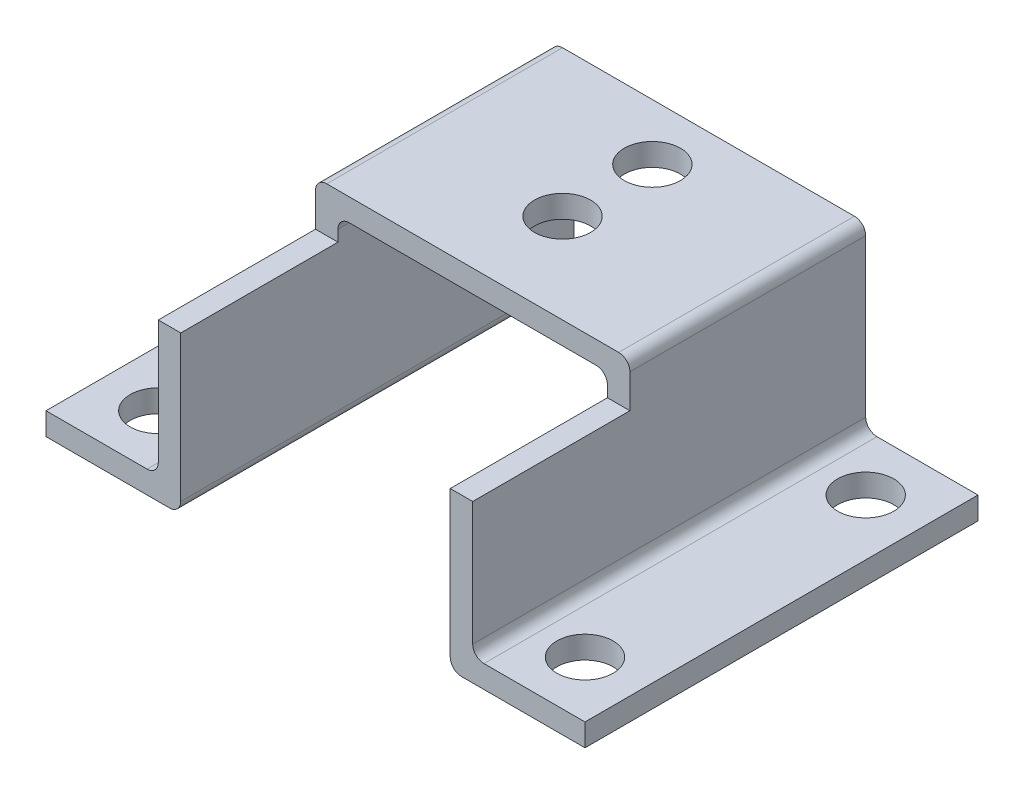
ISO-10303-21;
HEADER;
FILE_DESCRIPTION(('STEP AP214'),'2;1');
FILE_NAME('part.step','',(''),(''),'','','');
FILE_SCHEMA(('AUTOMOTIVE_DESIGN { 1 0 10303 214 1 1 1 1 }'));
ENDSEC;
DATA;
#1=APPLICATION_CONTEXT('core data for automotive mechanical design processes');
#2=APPLICATION_PROTOCOL_DEFINITION('international standard','automotive_design',2000,#1);
#3=PRODUCT_CONTEXT('',#1,'mechanical');
#4=PRODUCT('Part','Part','',(#3));
#5=PRODUCT_RELATED_PRODUCT_CATEGORY('part','',(#4));
#6=PRODUCT_DEFINITION_FORMATION('','',#4);
#7=PRODUCT_DEFINITION_CONTEXT('part definition',#1,'design');
#8=PRODUCT_DEFINITION('design','',#6,#7);
#9=PRODUCT_DEFINITION_SHAPE('','',#8);
#10=(LENGTH_UNIT() NAMED_UNIT(*) SI_UNIT(.MILLI.,.METRE.));
#11=(NAMED_UNIT(*) PLANE_ANGLE_UNIT() SI_UNIT($,.RADIAN.));
#12=(NAMED_UNIT(*) SI_UNIT($,.STERADIAN.) SOLID_ANGLE_UNIT());
#13=UNCERTAINTY_MEASURE_WITH_UNIT(LENGTH_MEASURE(1.E-05),#10,'distance_accuracy_value','');
#14=(GEOMETRIC_REPRESENTATION_CONTEXT(3) GLOBAL_UNCERTAINTY_ASSIGNED_CONTEXT((#13)) GLOBAL_UNIT_ASSIGNED_CONTEXT((#10,
#11,#12)) REPRESENTATION_CONTEXT('',''));
#15=CARTESIAN_POINT('',(0.,0.,0.));
#16=DIRECTION('',(0.,0.,1.));
#17=DIRECTION('',(1.,0.,0.));
#18=AXIS2_PLACEMENT_3D('',#15,#16,#17);
#19=CARTESIAN_POINT('',(-15.,1.,35.));
#20=DIRECTION('',(0.,0.,1.));
#21=DIRECTION('',(1.,0.,0.));
#22=AXIS2_PLACEMENT_3D('',#19,#20,#21);
#23=PLANE('',#22);
#24=DIRECTION('',(1.,0.,0.));
#25=VECTOR('',#24,1.);
#26=CARTESIAN_POINT('',(-15.,12.,35.));
#27=LINE('',#26,#25);
#28=CARTESIAN_POINT('',(-14.,12.,35.));
#29=VERTEX_POINT('',#28);
#30=CARTESIAN_POINT('',(-12.,12.,35.));
#31=VERTEX_POINT('',#30);
#32=EDGE_CURVE('E53',#29,#31,#27,.T.);
#33=ORIENTED_EDGE('',*,*,#32,.F.);
#34=DIRECTION('',(0.,-1.,0.));
#35=VECTOR('',#34,1.);
#36=CARTESIAN_POINT('',(-14.,1.00000000000001,35.));
#37=LINE('',#36,#35);
#38=CARTESIAN_POINT('',(-14.,1.,35.));
#39=VERTEX_POINT('',#38);
#40=EDGE_CURVE('E176',#29,#39,#37,.T.);
#41=ORIENTED_EDGE('',*,*,#40,.T.);
#42=CARTESIAN_POINT('',(-15.,1.,35.));
#43=DIRECTION('',(0.,0.,-1.));
#44=DIRECTION('',(1.,0.,0.));
#45=AXIS2_PLACEMENT_3D('',#42,#43,#44);
#46=CIRCLE('',#45,1.);
#47=CARTESIAN_POINT('',(-15.,0.,35.));
#48=VERTEX_POINT('',#47);
#49=EDGE_CURVE('E179',#39,#48,#46,.T.);
#50=ORIENTED_EDGE('',*,*,#49,.T.);
#51=DIRECTION('',(-1.,0.,0.));
#52=VECTOR('',#51,1.);
#53=CARTESIAN_POINT('',(-24.,0.,35.));
#54=LINE('',#53,#52);
#55=CARTESIAN_POINT('',(-24.,0.,35.));
#56=VERTEX_POINT('',#55);
#57=EDGE_CURVE('E70',#48,#56,#54,.T.);
#58=ORIENTED_EDGE('',*,*,#57,.T.);
#59=DIRECTION('',(0.,-1.,0.));
#60=VECTOR('',#59,1.);
#61=CARTESIAN_POINT('',(-24.,-2.,35.));
#62=LINE('',#61,#60);
#63=CARTESIAN_POINT('',(-24.,-2.,35.));
#64=VERTEX_POINT('',#63);
#65=EDGE_CURVE('E276',#56,#64,#62,.T.);
#66=ORIENTED_EDGE('',*,*,#65,.T.);
#67=DIRECTION('',(1.,0.,0.));
#68=VECTOR('',#67,1.);
#69=CARTESIAN_POINT('',(-13.,-2.,35.));
#70=LINE('',#69,#68);
#71=CARTESIAN_POINT('',(-13.,-2.,35.));
#72=VERTEX_POINT('',#71);
#73=EDGE_CURVE('E148',#64,#72,#70,.T.);
#74=ORIENTED_EDGE('',*,*,#73,.T.);
#75=CARTESIAN_POINT('',(-13.,-0.999999999999997,35.));
#76=DIRECTION('',(0.,0.,1.));
#77=DIRECTION('',(-1.,0.,0.));
#78=AXIS2_PLACEMENT_3D('',#75,#76,#77);
#79=CIRCLE('',#78,1.);
#80=CARTESIAN_POINT('',(-12.,-0.99999999999999,35.));
#81=VERTEX_POINT('',#80);
#82=EDGE_CURVE('E426',#72,#81,#79,.T.);
#83=ORIENTED_EDGE('',*,*,#82,.T.);
#84=DIRECTION('',(0.,1.,0.));
#85=VECTOR('',#84,1.);
#86=CARTESIAN_POINT('',(-12.,13.,35.));
#87=LINE('',#86,#85);
#88=EDGE_CURVE('E429',#81,#31,#87,.T.);
#89=ORIENTED_EDGE('',*,*,#88,.T.);
#90=EDGE_LOOP('',(#33,#41,#50,#58,#66,#74,#83,#89));
#91=FACE_BOUND('',#90,.T.);
#92=ADVANCED_FACE('F43',(#91),#23,.T.);
#93=CARTESIAN_POINT('',(-24.,-2.,35.));
#94=DIRECTION('',(1.,0.,0.));
#95=DIRECTION('',(0.,1.,0.));
#96=AXIS2_PLACEMENT_3D('',#93,#94,#95);
#97=PLANE('',#96);
#98=DIRECTION('',(0.,-1.,0.));
#99=VECTOR('',#98,1.);
#100=CARTESIAN_POINT('',(-24.,-2.,0.));
#101=LINE('',#100,#99);
#102=CARTESIAN_POINT('',(-24.,0.,0.));
#103=VERTEX_POINT('',#102);
#104=CARTESIAN_POINT('',(-24.,-2.,0.));
#105=VERTEX_POINT('',#104);
#106=EDGE_CURVE('E208',#103,#105,#101,.T.);
#107=ORIENTED_EDGE('',*,*,#106,.T.);
#108=DIRECTION('',(0.,0.,-1.));
#109=VECTOR('',#108,1.);
#110=CARTESIAN_POINT('',(-24.,-2.,35.));
#111=LINE('',#110,#109);
#112=EDGE_CURVE('E336',#64,#105,#111,.T.);
#113=ORIENTED_EDGE('',*,*,#112,.F.);
#114=ORIENTED_EDGE('',*,*,#65,.F.);
#115=DIRECTION('',(0.,0.,-1.));
#116=VECTOR('',#115,1.);
#117=CARTESIAN_POINT('',(-24.,0.,35.));
#118=LINE('',#117,#116);
#119=EDGE_CURVE('E204',#56,#103,#118,.T.);
#120=ORIENTED_EDGE('',*,*,#119,.T.);
#121=EDGE_LOOP('',(#107,#113,#114,#120));
#122=FACE_BOUND('',#121,.T.);
#123=ADVANCED_FACE('F45',(#122),#97,.F.);
#124=CARTESIAN_POINT('',(-13.,-2.,35.));
#125=DIRECTION('',(0.,1.,0.));
#126=DIRECTION('',(-1.,0.,0.));
#127=AXIS2_PLACEMENT_3D('',#124,#125,#126);
#128=PLANE('',#127);
#129=CARTESIAN_POINT('',(-19.,-2.00000000000001,30.));
#130=DIRECTION('',(0.,1.,0.));
#131=DIRECTION('',(-1.,0.,0.));
#132=AXIS2_PLACEMENT_3D('',#129,#130,#131);
#133=CIRCLE('',#132,2.5);
#134=CARTESIAN_POINT('',(-21.5,-2.00000000000001,30.));
#135=VERTEX_POINT('',#134);
#136=EDGE_CURVE('E653',#135,#135,#133,.T.);
#137=ORIENTED_EDGE('',*,*,#136,.T.);
#138=EDGE_LOOP('',(#137));
#139=FACE_BOUND('',#138,.T.);
#140=CARTESIAN_POINT('',(-19.,-2.00000000000001,5.));
#141=DIRECTION('',(0.,1.,0.));
#142=DIRECTION('',(-1.,0.,0.));
#143=AXIS2_PLACEMENT_3D('',#140,#141,#142);
#144=CIRCLE('',#143,2.5);
#145=CARTESIAN_POINT('',(-21.5,-2.00000000000001,5.));
#146=VERTEX_POINT('',#145);
#147=EDGE_CURVE('E347',#146,#146,#144,.T.);
#148=ORIENTED_EDGE('',*,*,#147,.T.);
#149=EDGE_LOOP('',(#148));
#150=FACE_BOUND('',#149,.T.);
#151=DIRECTION('',(1.,0.,0.));
#152=VECTOR('',#151,1.);
#153=CARTESIAN_POINT('',(-13.,-2.,0.));
#154=LINE('',#153,#152);
#155=CARTESIAN_POINT('',(-13.,-2.,0.));
#156=VERTEX_POINT('',#155);
#157=EDGE_CURVE('E212',#105,#156,#154,.T.);
#158=ORIENTED_EDGE('',*,*,#157,.T.);
#159=DIRECTION('',(0.,0.,-1.));
#160=VECTOR('',#159,1.);
#161=CARTESIAN_POINT('',(-13.,-2.,35.));
#162=LINE('',#161,#160);
#163=EDGE_CURVE('E332',#72,#156,#162,.T.);
#164=ORIENTED_EDGE('',*,*,#163,.F.);
#165=ORIENTED_EDGE('',*,*,#73,.F.);
#166=ORIENTED_EDGE('',*,*,#112,.T.);
#167=EDGE_LOOP('',(#158,#164,#165,#166));
#168=FACE_BOUND('',#167,.T.);
#169=ADVANCED_FACE('F573',(#139,#150,#168),#128,.F.);
#170=CARTESIAN_POINT('',(-13.,-0.999999999999997,35.));
#171=DIRECTION('',(0.,0.,-1.));
#172=DIRECTION('',(-1.,0.,0.));
#173=AXIS2_PLACEMENT_3D('',#170,#171,#172);
#174=CYLINDRICAL_SURFACE('',#173,1.);
#175=CARTESIAN_POINT('',(-13.,-0.999999999999997,0.));
#176=DIRECTION('',(0.,0.,1.));
#177=DIRECTION('',(-1.,0.,0.));
#178=AXIS2_PLACEMENT_3D('',#175,#176,#177);
#179=CIRCLE('',#178,1.);
#180=CARTESIAN_POINT('',(-12.,-0.99999999999999,0.));
#181=VERTEX_POINT('',#180);
#182=EDGE_CURVE('E216',#156,#181,#179,.T.);
#183=ORIENTED_EDGE('',*,*,#182,.T.);
#184=DIRECTION('',(0.,0.,-1.));
#185=VECTOR('',#184,1.);
#186=CARTESIAN_POINT('',(-12.,-0.99999999999999,35.));
#187=LINE('',#186,#185);
#188=EDGE_CURVE('E328',#81,#181,#187,.T.);
#189=ORIENTED_EDGE('',*,*,#188,.F.);
#190=ORIENTED_EDGE('',*,*,#82,.F.);
#191=ORIENTED_EDGE('',*,*,#163,.T.);
#192=EDGE_LOOP('',(#183,#189,#190,#191));
#193=FACE_BOUND('',#192,.T.);
#194=ADVANCED_FACE('F571',(#193),#174,.T.);
#195=CARTESIAN_POINT('',(-12.,13.,35.));
#196=DIRECTION('',(-1.,0.,0.));
#197=DIRECTION('',(0.,-1.,0.));
#198=AXIS2_PLACEMENT_3D('',#195,#196,#197);
#199=PLANE('',#198);
#200=DIRECTION('',(0.,0.,-1.));
#201=VECTOR('',#200,1.);
#202=CARTESIAN_POINT('',(-12.,13.,35.));
#203=LINE('',#202,#201);
#204=CARTESIAN_POINT('',(-12.,13.,21.));
#205=VERTEX_POINT('',#204);
#206=CARTESIAN_POINT('',(-12.,13.,0.));
#207=VERTEX_POINT('',#206);
#208=EDGE_CURVE('E325',#205,#207,#203,.T.);
#209=ORIENTED_EDGE('',*,*,#208,.F.);
#210=DIRECTION('',(0.,-1.,0.));
#211=VECTOR('',#210,1.);
#212=CARTESIAN_POINT('',(-12.,13.,21.));
#213=LINE('',#212,#211);
#214=CARTESIAN_POINT('',(-12.,12.,21.));
#215=VERTEX_POINT('',#214);
#216=EDGE_CURVE('E213',#205,#215,#213,.T.);
#217=ORIENTED_EDGE('',*,*,#216,.T.);
#218=DIRECTION('',(0.,0.,1.));
#219=VECTOR('',#218,1.);
#220=CARTESIAN_POINT('',(-12.,12.,35.));
#221=LINE('',#220,#219);
#222=EDGE_CURVE('E391',#215,#31,#221,.T.);
#223=ORIENTED_EDGE('',*,*,#222,.T.);
#224=ORIENTED_EDGE('',*,*,#88,.F.);
#225=ORIENTED_EDGE('',*,*,#188,.T.);
#226=DIRECTION('',(0.,1.,0.));
#227=VECTOR('',#226,1.);
#228=CARTESIAN_POINT('',(-12.,13.,0.));
#229=LINE('',#228,#227);
#230=EDGE_CURVE('E219',#181,#207,#229,.T.);
#231=ORIENTED_EDGE('',*,*,#230,.T.);
#232=EDGE_LOOP('',(#209,#217,#223,#224,#225,#231));
#233=FACE_BOUND('',#232,.T.);
#234=ADVANCED_FACE('F510',(#233),#199,.F.);
#235=CARTESIAN_POINT('',(-11.,13.,35.));
#236=DIRECTION('',(0.,0.,-1.));
#237=DIRECTION('',(-1.,0.,0.));
#238=AXIS2_PLACEMENT_3D('',#235,#236,#237);
#239=CYLINDRICAL_SURFACE('',#238,0.999999999999999);
#240=DIRECTION('',(0.,0.,-1.));
#241=VECTOR('',#240,1.);
#242=CARTESIAN_POINT('',(-11.,14.,35.));
#243=LINE('',#242,#241);
#244=CARTESIAN_POINT('',(-11.,14.,21.));
#245=VERTEX_POINT('',#244);
#246=CARTESIAN_POINT('',(-11.,14.,0.));
#247=VERTEX_POINT('',#246);
#248=EDGE_CURVE('E322',#245,#247,#243,.T.);
#249=ORIENTED_EDGE('',*,*,#248,.F.);
#250=CARTESIAN_POINT('',(-11.,13.,21.));
#251=DIRECTION('',(0.,0.,-1.));
#252=DIRECTION('',(-1.,0.,0.));
#253=AXIS2_PLACEMENT_3D('',#250,#251,#252);
#254=CIRCLE('',#253,0.999999999999999);
#255=EDGE_CURVE('E415',#245,#205,#254,.F.);
#256=ORIENTED_EDGE('',*,*,#255,.T.);
#257=ORIENTED_EDGE('',*,*,#208,.T.);
#258=CARTESIAN_POINT('',(-11.,13.,0.));
#259=DIRECTION('',(0.,0.,-1.));
#260=DIRECTION('',(1.,0.,0.));
#261=AXIS2_PLACEMENT_3D('',#258,#259,#260);
#262=CIRCLE('',#261,0.999999999999999);
#263=EDGE_CURVE('E223',#207,#247,#262,.T.);
#264=ORIENTED_EDGE('',*,*,#263,.T.);
#265=EDGE_LOOP('',(#249,#256,#257,#264));
#266=FACE_BOUND('',#265,.T.);
#267=ADVANCED_FACE('F509',(#266),#239,.F.);
#268=CARTESIAN_POINT('',(11.,14.,35.));
#269=DIRECTION('',(0.,1.,0.));
#270=DIRECTION('',(-1.,0.,0.));
#271=AXIS2_PLACEMENT_3D('',#268,#269,#270);
#272=PLANE('',#271);
#273=CARTESIAN_POINT('',(0.,14.,13.));
#274=DIRECTION('',(0.,1.,0.));
#275=DIRECTION('',(-1.,0.,0.));
#276=AXIS2_PLACEMENT_3D('',#273,#274,#275);
#277=CIRCLE('',#276,2.5);
#278=CARTESIAN_POINT('',(-2.5,14.,13.));
#279=VERTEX_POINT('',#278);
#280=EDGE_CURVE('E354',#279,#279,#277,.T.);
#281=ORIENTED_EDGE('',*,*,#280,.T.);
#282=EDGE_LOOP('',(#281));
#283=FACE_BOUND('',#282,.T.);
#284=CARTESIAN_POINT('',(0.,14.,5.));
#285=DIRECTION('',(0.,1.,0.));
#286=DIRECTION('',(-1.,0.,0.));
#287=AXIS2_PLACEMENT_3D('',#284,#285,#286);
#288=CIRCLE('',#287,2.5);
#289=CARTESIAN_POINT('',(-2.5,14.,5.));
#290=VERTEX_POINT('',#289);
#291=EDGE_CURVE('E350',#290,#290,#288,.T.);
#292=ORIENTED_EDGE('',*,*,#291,.T.);
#293=EDGE_LOOP('',(#292));
#294=FACE_BOUND('',#293,.T.);
#295=DIRECTION('',(0.,0.,-1.));
#296=VECTOR('',#295,1.);
#297=CARTESIAN_POINT('',(11.,14.,35.));
#298=LINE('',#297,#296);
#299=CARTESIAN_POINT('',(11.,14.,21.));
#300=VERTEX_POINT('',#299);
#301=CARTESIAN_POINT('',(11.,14.,0.));
#302=VERTEX_POINT('',#301);
#303=EDGE_CURVE('E319',#300,#302,#298,.T.);
#304=ORIENTED_EDGE('',*,*,#303,.F.);
#305=DIRECTION('',(-1.,0.,0.));
#306=VECTOR('',#305,1.);
#307=CARTESIAN_POINT('',(11.,14.,21.));
#308=LINE('',#307,#306);
#309=EDGE_CURVE('E411',#300,#245,#308,.T.);
#310=ORIENTED_EDGE('',*,*,#309,.T.);
#311=ORIENTED_EDGE('',*,*,#248,.T.);
#312=DIRECTION('',(1.,0.,0.));
#313=VECTOR('',#312,1.);
#314=CARTESIAN_POINT('',(11.,14.,0.));
#315=LINE('',#314,#313);
#316=EDGE_CURVE('E227',#247,#302,#315,.T.);
#317=ORIENTED_EDGE('',*,*,#316,.T.);
#318=EDGE_LOOP('',(#304,#310,#311,#317));
#319=FACE_BOUND('',#318,.T.);
#320=ADVANCED_FACE('F524',(#283,#294,#319),#272,.F.);
#321=CARTESIAN_POINT('',(11.,13.,35.));
#322=DIRECTION('',(0.,0.,-1.));
#323=DIRECTION('',(-1.,0.,0.));
#324=AXIS2_PLACEMENT_3D('',#321,#322,#323);
#325=CYLINDRICAL_SURFACE('',#324,0.999999999999999);
#326=DIRECTION('',(0.,0.,-1.));
#327=VECTOR('',#326,1.);
#328=CARTESIAN_POINT('',(12.,13.,35.));
#329=LINE('',#328,#327);
#330=CARTESIAN_POINT('',(12.,13.,21.));
#331=VERTEX_POINT('',#330);
#332=CARTESIAN_POINT('',(12.,13.,0.));
#333=VERTEX_POINT('',#332);
#334=EDGE_CURVE('E316',#331,#333,#329,.T.);
#335=ORIENTED_EDGE('',*,*,#334,.F.);
#336=CARTESIAN_POINT('',(11.,13.,21.));
#337=DIRECTION('',(0.,0.,-1.));
#338=DIRECTION('',(-1.,0.,0.));
#339=AXIS2_PLACEMENT_3D('',#336,#337,#338);
#340=CIRCLE('',#339,0.999999999999999);
#341=EDGE_CURVE('E407',#331,#300,#340,.F.);
#342=ORIENTED_EDGE('',*,*,#341,.T.);
#343=ORIENTED_EDGE('',*,*,#303,.T.);
#344=CARTESIAN_POINT('',(11.,13.,0.));
#345=DIRECTION('',(0.,0.,-1.));
#346=DIRECTION('',(1.,0.,0.));
#347=AXIS2_PLACEMENT_3D('',#344,#345,#346);
#348=CIRCLE('',#347,0.999999999999999);
#349=EDGE_CURVE('E231',#302,#333,#348,.T.);
#350=ORIENTED_EDGE('',*,*,#349,.T.);
#351=EDGE_LOOP('',(#335,#342,#343,#350));
#352=FACE_BOUND('',#351,.T.);
#353=ADVANCED_FACE('F527',(#352),#325,.F.);
#354=CARTESIAN_POINT('',(12.,13.,35.));
#355=DIRECTION('',(1.,0.,0.));
#356=DIRECTION('',(0.,1.,0.));
#357=AXIS2_PLACEMENT_3D('',#354,#355,#356);
#358=PLANE('',#357);
#359=DIRECTION('',(0.,0.,-1.));
#360=VECTOR('',#359,1.);
#361=CARTESIAN_POINT('',(12.,12.,35.));
#362=LINE('',#361,#360);
#363=CARTESIAN_POINT('',(12.,12.,35.));
#364=VERTEX_POINT('',#363);
#365=CARTESIAN_POINT('',(12.,12.,21.));
#366=VERTEX_POINT('',#365);
#367=EDGE_CURVE('E61',#364,#366,#362,.T.);
#368=ORIENTED_EDGE('',*,*,#367,.T.);
#369=DIRECTION('',(0.,1.,0.));
#370=VECTOR('',#369,1.);
#371=CARTESIAN_POINT('',(12.,13.,21.));
#372=LINE('',#371,#370);
#373=EDGE_CURVE('E403',#366,#331,#372,.T.);
#374=ORIENTED_EDGE('',*,*,#373,.T.);
#375=ORIENTED_EDGE('',*,*,#334,.T.);
#376=DIRECTION('',(0.,-1.,0.));
#377=VECTOR('',#376,1.);
#378=CARTESIAN_POINT('',(12.,13.,0.));
#379=LINE('',#378,#377);
#380=CARTESIAN_POINT('',(12.,-0.999999999999994,0.));
#381=VERTEX_POINT('',#380);
#382=EDGE_CURVE('E235',#333,#381,#379,.T.);
#383=ORIENTED_EDGE('',*,*,#382,.T.);
#384=DIRECTION('',(0.,0.,-1.));
#385=VECTOR('',#384,1.);
#386=CARTESIAN_POINT('',(12.,-0.999999999999994,35.));
#387=LINE('',#386,#385);
#388=CARTESIAN_POINT('',(12.,-0.999999999999994,35.));
#389=VERTEX_POINT('',#388);
#390=EDGE_CURVE('E312',#389,#381,#387,.T.);
#391=ORIENTED_EDGE('',*,*,#390,.F.);
#392=DIRECTION('',(0.,-1.,0.));
#393=VECTOR('',#392,1.);
#394=CARTESIAN_POINT('',(12.,13.,35.));
#395=LINE('',#394,#393);
#396=EDGE_CURVE('E432',#364,#389,#395,.T.);
#397=ORIENTED_EDGE('',*,*,#396,.F.);
#398=EDGE_LOOP('',(#368,#374,#375,#383,#391,#397));
#399=FACE_BOUND('',#398,.T.);
#400=ADVANCED_FACE('F529',(#399),#358,.F.);
#401=CARTESIAN_POINT('',(13.,-0.999999999999994,35.));
#402=DIRECTION('',(0.,0.,-1.));
#403=DIRECTION('',(-1.,0.,0.));
#404=AXIS2_PLACEMENT_3D('',#401,#402,#403);
#405=CYLINDRICAL_SURFACE('',#404,1.);
#406=CARTESIAN_POINT('',(13.,-0.999999999999994,0.));
#407=DIRECTION('',(0.,0.,1.));
#408=DIRECTION('',(-1.,0.,0.));
#409=AXIS2_PLACEMENT_3D('',#406,#407,#408);
#410=CIRCLE('',#409,1.);
#411=CARTESIAN_POINT('',(13.,-1.99999999999999,0.));
#412=VERTEX_POINT('',#411);
#413=EDGE_CURVE('E238',#381,#412,#410,.T.);
#414=ORIENTED_EDGE('',*,*,#413,.T.);
#415=DIRECTION('',(0.,0.,-1.));
#416=VECTOR('',#415,1.);
#417=CARTESIAN_POINT('',(13.,-1.99999999999999,35.));
#418=LINE('',#417,#416);
#419=CARTESIAN_POINT('',(13.,-1.99999999999999,35.));
#420=VERTEX_POINT('',#419);
#421=EDGE_CURVE('E308',#420,#412,#418,.T.);
#422=ORIENTED_EDGE('',*,*,#421,.F.);
#423=CARTESIAN_POINT('',(13.,-0.999999999999994,35.));
#424=DIRECTION('',(0.,0.,1.));
#425=DIRECTION('',(-1.,0.,0.));
#426=AXIS2_PLACEMENT_3D('',#423,#424,#425);
#427=CIRCLE('',#426,1.);
#428=EDGE_CURVE('E435',#389,#420,#427,.T.);
#429=ORIENTED_EDGE('',*,*,#428,.F.);
#430=ORIENTED_EDGE('',*,*,#390,.T.);
#431=EDGE_LOOP('',(#414,#422,#429,#430));
#432=FACE_BOUND('',#431,.T.);
#433=ADVANCED_FACE('F536',(#432),#405,.T.);
#434=CARTESIAN_POINT('',(13.,-1.99999999999999,35.));
#435=DIRECTION('',(0.,1.,0.));
#436=DIRECTION('',(-1.,0.,0.));
#437=AXIS2_PLACEMENT_3D('',#434,#435,#436);
#438=PLANE('',#437);
#439=CARTESIAN_POINT('',(19.,-2.,30.));
#440=DIRECTION('',(0.,1.,0.));
#441=DIRECTION('',(1.,0.,0.));
#442=AXIS2_PLACEMENT_3D('',#439,#440,#441);
#443=CIRCLE('',#442,2.5);
#444=CARTESIAN_POINT('',(21.5,-2.,30.));
#445=VERTEX_POINT('',#444);
#446=EDGE_CURVE('E658',#445,#445,#443,.T.);
#447=ORIENTED_EDGE('',*,*,#446,.T.);
#448=EDGE_LOOP('',(#447));
#449=FACE_BOUND('',#448,.T.);
#450=CARTESIAN_POINT('',(19.,-2.,5.));
#451=DIRECTION('',(0.,1.,0.));
#452=DIRECTION('',(1.,0.,0.));
#453=AXIS2_PLACEMENT_3D('',#450,#451,#452);
#454=CIRCLE('',#453,2.5);
#455=CARTESIAN_POINT('',(21.5,-2.,5.));
#456=VERTEX_POINT('',#455);
#457=EDGE_CURVE('E665',#456,#456,#454,.T.);
#458=ORIENTED_EDGE('',*,*,#457,.T.);
#459=EDGE_LOOP('',(#458));
#460=FACE_BOUND('',#459,.T.);
#461=DIRECTION('',(1.,0.,0.));
#462=VECTOR('',#461,1.);
#463=CARTESIAN_POINT('',(13.,-1.99999999999999,0.));
#464=LINE('',#463,#462);
#465=CARTESIAN_POINT('',(24.,-1.99999999999999,0.));
#466=VERTEX_POINT('',#465);
#467=EDGE_CURVE('E241',#412,#466,#464,.T.);
#468=ORIENTED_EDGE('',*,*,#467,.T.);
#469=DIRECTION('',(0.,0.,-1.));
#470=VECTOR('',#469,1.);
#471=CARTESIAN_POINT('',(24.,-1.99999999999999,35.));
#472=LINE('',#471,#470);
#473=CARTESIAN_POINT('',(24.,-1.99999999999999,35.));
#474=VERTEX_POINT('',#473);
#475=EDGE_CURVE('E304',#474,#466,#472,.T.);
#476=ORIENTED_EDGE('',*,*,#475,.F.);
#477=DIRECTION('',(1.,0.,0.));
#478=VECTOR('',#477,1.);
#479=CARTESIAN_POINT('',(13.,-1.99999999999999,35.));
#480=LINE('',#479,#478);
#481=EDGE_CURVE('E438',#420,#474,#480,.T.);
#482=ORIENTED_EDGE('',*,*,#481,.F.);
#483=ORIENTED_EDGE('',*,*,#421,.T.);
#484=EDGE_LOOP('',(#468,#476,#482,#483));
#485=FACE_BOUND('',#484,.T.);
#486=ADVANCED_FACE('F540',(#449,#460,#485),#438,.F.);
#487=CARTESIAN_POINT('',(24.,-1.99999999999999,35.));
#488=DIRECTION('',(-1.,0.,0.));
#489=DIRECTION('',(0.,-1.,0.));
#490=AXIS2_PLACEMENT_3D('',#487,#488,#489);
#491=PLANE('',#490);
#492=DIRECTION('',(0.,1.,0.));
#493=VECTOR('',#492,1.);
#494=CARTESIAN_POINT('',(24.,-1.99999999999999,0.));
#495=LINE('',#494,#493);
#496=CARTESIAN_POINT('',(24.,0.,0.));
#497=VERTEX_POINT('',#496);
#498=EDGE_CURVE('E244',#466,#497,#495,.T.);
#499=ORIENTED_EDGE('',*,*,#498,.T.);
#500=DIRECTION('',(0.,0.,-1.));
#501=VECTOR('',#500,1.);
#502=CARTESIAN_POINT('',(24.,0.,35.));
#503=LINE('',#502,#501);
#504=CARTESIAN_POINT('',(24.,0.,35.));
#505=VERTEX_POINT('',#504);
#506=EDGE_CURVE('E300',#505,#497,#503,.T.);
#507=ORIENTED_EDGE('',*,*,#506,.F.);
#508=DIRECTION('',(0.,1.,0.));
#509=VECTOR('',#508,1.);
#510=CARTESIAN_POINT('',(24.,-1.99999999999999,35.));
#511=LINE('',#510,#509);
#512=EDGE_CURVE('E441',#474,#505,#511,.T.);
#513=ORIENTED_EDGE('',*,*,#512,.F.);
#514=ORIENTED_EDGE('',*,*,#475,.T.);
#515=EDGE_LOOP('',(#499,#507,#513,#514));
#516=FACE_BOUND('',#515,.T.);
#517=ADVANCED_FACE('F545',(#516),#491,.F.);
#518=CARTESIAN_POINT('',(24.,0.,35.));
#519=DIRECTION('',(0.,-1.,0.));
#520=DIRECTION('',(1.,0.,0.));
#521=AXIS2_PLACEMENT_3D('',#518,#519,#520);
#522=PLANE('',#521);
#523=CARTESIAN_POINT('',(19.,0.,30.));
#524=DIRECTION('',(0.,-1.,0.));
#525=DIRECTION('',(1.,0.,0.));
#526=AXIS2_PLACEMENT_3D('',#523,#524,#525);
#527=CIRCLE('',#526,2.5);
#528=CARTESIAN_POINT('',(21.5,0.,30.));
#529=VERTEX_POINT('',#528);
#530=EDGE_CURVE('E47',#529,#529,#527,.T.);
#531=ORIENTED_EDGE('',*,*,#530,.T.);
#532=EDGE_LOOP('',(#531));
#533=FACE_BOUND('',#532,.T.);
#534=CARTESIAN_POINT('',(19.,0.,5.));
#535=DIRECTION('',(0.,-1.,0.));
#536=DIRECTION('',(1.,0.,0.));
#537=AXIS2_PLACEMENT_3D('',#534,#535,#536);
#538=CIRCLE('',#537,2.5);
#539=CARTESIAN_POINT('',(21.5,0.,5.));
#540=VERTEX_POINT('',#539);
#541=EDGE_CURVE('E351',#540,#540,#538,.T.);
#542=ORIENTED_EDGE('',*,*,#541,.T.);
#543=EDGE_LOOP('',(#542));
#544=FACE_BOUND('',#543,.T.);
#545=DIRECTION('',(-1.,0.,0.));
#546=VECTOR('',#545,1.);
#547=CARTESIAN_POINT('',(24.,0.,0.));
#548=LINE('',#547,#546);
#549=CARTESIAN_POINT('',(15.,0.,0.));
#550=VERTEX_POINT('',#549);
#551=EDGE_CURVE('E247',#497,#550,#548,.T.);
#552=ORIENTED_EDGE('',*,*,#551,.T.);
#553=DIRECTION('',(0.,0.,-1.));
#554=VECTOR('',#553,1.);
#555=CARTESIAN_POINT('',(15.,0.,35.));
#556=LINE('',#555,#554);
#557=CARTESIAN_POINT('',(15.,0.,35.));
#558=VERTEX_POINT('',#557);
#559=EDGE_CURVE('E296',#558,#550,#556,.T.);
#560=ORIENTED_EDGE('',*,*,#559,.F.);
#561=DIRECTION('',(-1.,0.,0.));
#562=VECTOR('',#561,1.);
#563=CARTESIAN_POINT('',(24.,0.,35.));
#564=LINE('',#563,#562);
#565=EDGE_CURVE('E444',#505,#558,#564,.T.);
#566=ORIENTED_EDGE('',*,*,#565,.F.);
#567=ORIENTED_EDGE('',*,*,#506,.T.);
#568=EDGE_LOOP('',(#552,#560,#566,#567));
#569=FACE_BOUND('',#568,.T.);
#570=ADVANCED_FACE('F549',(#533,#544,#569),#522,.F.);
#571=CARTESIAN_POINT('',(15.,1.,35.));
#572=DIRECTION('',(0.,0.,-1.));
#573=DIRECTION('',(-1.,0.,0.));
#574=AXIS2_PLACEMENT_3D('',#571,#572,#573);
#575=CYLINDRICAL_SURFACE('',#574,1.);
#576=CARTESIAN_POINT('',(15.,1.,0.));
#577=DIRECTION('',(0.,0.,-1.));
#578=DIRECTION('',(1.,0.,0.));
#579=AXIS2_PLACEMENT_3D('',#576,#577,#578);
#580=CIRCLE('',#579,1.);
#581=CARTESIAN_POINT('',(14.,1.00000000000001,0.));
#582=VERTEX_POINT('',#581);
#583=EDGE_CURVE('E250',#550,#582,#580,.T.);
#584=ORIENTED_EDGE('',*,*,#583,.T.);
#585=DIRECTION('',(0.,0.,-1.));
#586=VECTOR('',#585,1.);
#587=CARTESIAN_POINT('',(14.,1.00000000000001,35.));
#588=LINE('',#587,#586);
#589=CARTESIAN_POINT('',(14.,1.00000000000001,35.));
#590=VERTEX_POINT('',#589);
#591=EDGE_CURVE('E292',#590,#582,#588,.T.);
#592=ORIENTED_EDGE('',*,*,#591,.F.);
#593=CARTESIAN_POINT('',(15.,1.,35.));
#594=DIRECTION('',(0.,0.,-1.));
#595=DIRECTION('',(1.,0.,0.));
#596=AXIS2_PLACEMENT_3D('',#593,#594,#595);
#597=CIRCLE('',#596,1.);
#598=EDGE_CURVE('E447',#558,#590,#597,.T.);
#599=ORIENTED_EDGE('',*,*,#598,.F.);
#600=ORIENTED_EDGE('',*,*,#559,.T.);
#601=EDGE_LOOP('',(#584,#592,#599,#600));
#602=FACE_BOUND('',#601,.T.);
#603=ADVANCED_FACE('F553',(#602),#575,.F.);
#604=CARTESIAN_POINT('',(14.,1.00000000000001,35.));
#605=DIRECTION('',(-1.,0.,0.));
#606=DIRECTION('',(0.,-1.,0.));
#607=AXIS2_PLACEMENT_3D('',#604,#605,#606);
#608=PLANE('',#607);
#609=DIRECTION('',(0.,0.,-1.));
#610=VECTOR('',#609,1.);
#611=CARTESIAN_POINT('',(14.,15.,35.));
#612=LINE('',#611,#610);
#613=CARTESIAN_POINT('',(14.,15.,21.));
#614=VERTEX_POINT('',#613);
#615=CARTESIAN_POINT('',(14.,15.,0.));
#616=VERTEX_POINT('',#615);
#617=EDGE_CURVE('E289',#614,#616,#612,.T.);
#618=ORIENTED_EDGE('',*,*,#617,.F.);
#619=DIRECTION('',(0.,1.,0.));
#620=VECTOR('',#619,1.);
#621=CARTESIAN_POINT('',(14.,16.,21.));
#622=LINE('',#621,#620);
#623=CARTESIAN_POINT('',(14.,12.,21.));
#624=VERTEX_POINT('',#623);
#625=EDGE_CURVE('E373',#624,#614,#622,.T.);
#626=ORIENTED_EDGE('',*,*,#625,.F.);
#627=DIRECTION('',(0.,0.,-1.));
#628=VECTOR('',#627,1.);
#629=CARTESIAN_POINT('',(14.,12.,35.));
#630=LINE('',#629,#628);
#631=CARTESIAN_POINT('',(14.,12.,35.));
#632=VERTEX_POINT('',#631);
#633=EDGE_CURVE('E360',#632,#624,#630,.T.);
#634=ORIENTED_EDGE('',*,*,#633,.F.);
#635=DIRECTION('',(0.,1.,0.));
#636=VECTOR('',#635,1.);
#637=CARTESIAN_POINT('',(14.,1.00000000000001,35.));
#638=LINE('',#637,#636);
#639=EDGE_CURVE('E187',#590,#632,#638,.T.);
#640=ORIENTED_EDGE('',*,*,#639,.F.);
#641=ORIENTED_EDGE('',*,*,#591,.T.);
#642=DIRECTION('',(0.,1.,0.));
#643=VECTOR('',#642,1.);
#644=CARTESIAN_POINT('',(14.,1.00000000000001,0.));
#645=LINE('',#644,#643);
#646=EDGE_CURVE('E253',#582,#616,#645,.T.);
#647=ORIENTED_EDGE('',*,*,#646,.T.);
#648=EDGE_LOOP('',(#618,#626,#634,#640,#641,#647));
#649=FACE_BOUND('',#648,.T.);
#650=ADVANCED_FACE('F463',(#649),#608,.F.);
#651=CARTESIAN_POINT('',(13.,15.,35.));
#652=DIRECTION('',(0.,0.,-1.));
#653=DIRECTION('',(-1.,0.,0.));
#654=AXIS2_PLACEMENT_3D('',#651,#652,#653);
#655=CYLINDRICAL_SURFACE('',#654,1.);
#656=DIRECTION('',(0.,0.,-1.));
#657=VECTOR('',#656,1.);
#658=CARTESIAN_POINT('',(13.,16.,35.));
#659=LINE('',#658,#657);
#660=CARTESIAN_POINT('',(13.,16.,21.));
#661=VERTEX_POINT('',#660);
#662=CARTESIAN_POINT('',(13.,16.,0.));
#663=VERTEX_POINT('',#662);
#664=EDGE_CURVE('E286',#661,#663,#659,.T.);
#665=ORIENTED_EDGE('',*,*,#664,.F.);
#666=CARTESIAN_POINT('',(13.,15.,21.));
#667=DIRECTION('',(0.,0.,-1.));
#668=DIRECTION('',(-1.,0.,0.));
#669=AXIS2_PLACEMENT_3D('',#666,#667,#668);
#670=CIRCLE('',#669,1.);
#671=EDGE_CURVE('E399',#661,#614,#670,.T.);
#672=ORIENTED_EDGE('',*,*,#671,.T.);
#673=ORIENTED_EDGE('',*,*,#617,.T.);
#674=CARTESIAN_POINT('',(13.,15.,0.));
#675=DIRECTION('',(0.,0.,1.));
#676=DIRECTION('',(1.,0.,0.));
#677=AXIS2_PLACEMENT_3D('',#674,#675,#676);
#678=CIRCLE('',#677,1.);
#679=EDGE_CURVE('E257',#616,#663,#678,.T.);
#680=ORIENTED_EDGE('',*,*,#679,.T.);
#681=EDGE_LOOP('',(#665,#672,#673,#680));
#682=FACE_BOUND('',#681,.T.);
#683=ADVANCED_FACE('F558',(#682),#655,.T.);
#684=CARTESIAN_POINT('',(-13.,16.,35.));
#685=DIRECTION('',(0.,-1.,0.));
#686=DIRECTION('',(1.,0.,0.));
#687=AXIS2_PLACEMENT_3D('',#684,#685,#686);
#688=PLANE('',#687);
#689=CARTESIAN_POINT('',(0.,16.,13.));
#690=DIRECTION('',(0.,1.,0.));
#691=DIRECTION('',(-1.,0.,0.));
#692=AXIS2_PLACEMENT_3D('',#689,#690,#691);
#693=CIRCLE('',#692,2.5);
#694=CARTESIAN_POINT('',(-2.5,16.,13.));
#695=VERTEX_POINT('',#694);
#696=EDGE_CURVE('E661',#695,#695,#693,.T.);
#697=ORIENTED_EDGE('',*,*,#696,.F.);
#698=EDGE_LOOP('',(#697));
#699=FACE_BOUND('',#698,.T.);
#700=CARTESIAN_POINT('',(0.,16.,5.));
#701=DIRECTION('',(0.,1.,0.));
#702=DIRECTION('',(-1.,0.,0.));
#703=AXIS2_PLACEMENT_3D('',#700,#701,#702);
#704=CIRCLE('',#703,2.5);
#705=CARTESIAN_POINT('',(-2.5,16.,5.));
#706=VERTEX_POINT('',#705);
#707=EDGE_CURVE('E630',#706,#706,#704,.T.);
#708=ORIENTED_EDGE('',*,*,#707,.F.);
#709=EDGE_LOOP('',(#708));
#710=FACE_BOUND('',#709,.T.);
#711=DIRECTION('',(0.,0.,-1.));
#712=VECTOR('',#711,1.);
#713=CARTESIAN_POINT('',(-13.,16.,35.));
#714=LINE('',#713,#712);
#715=CARTESIAN_POINT('',(-13.,16.,21.));
#716=VERTEX_POINT('',#715);
#717=CARTESIAN_POINT('',(-13.,16.,0.));
#718=VERTEX_POINT('',#717);
#719=EDGE_CURVE('E283',#716,#718,#714,.T.);
#720=ORIENTED_EDGE('',*,*,#719,.F.);
#721=DIRECTION('',(1.,0.,0.));
#722=VECTOR('',#721,1.);
#723=CARTESIAN_POINT('',(-24.,16.,21.));
#724=LINE('',#723,#722);
#725=EDGE_CURVE('E378',#716,#661,#724,.T.);
#726=ORIENTED_EDGE('',*,*,#725,.T.);
#727=ORIENTED_EDGE('',*,*,#664,.T.);
#728=DIRECTION('',(-1.,0.,0.));
#729=VECTOR('',#728,1.);
#730=CARTESIAN_POINT('',(-13.,16.,0.));
#731=LINE('',#730,#729);
#732=EDGE_CURVE('E261',#663,#718,#731,.T.);
#733=ORIENTED_EDGE('',*,*,#732,.T.);
#734=EDGE_LOOP('',(#720,#726,#727,#733));
#735=FACE_BOUND('',#734,.T.);
#736=ADVANCED_FACE('F561',(#699,#710,#735),#688,.F.);
#737=CARTESIAN_POINT('',(-13.,15.,35.));
#738=DIRECTION('',(0.,0.,-1.));
#739=DIRECTION('',(-1.,0.,0.));
#740=AXIS2_PLACEMENT_3D('',#737,#738,#739);
#741=CYLINDRICAL_SURFACE('',#740,0.999999999999999);
#742=DIRECTION('',(0.,0.,-1.));
#743=VECTOR('',#742,1.);
#744=CARTESIAN_POINT('',(-14.,15.,35.));
#745=LINE('',#744,#743);
#746=CARTESIAN_POINT('',(-14.,15.,21.));
#747=VERTEX_POINT('',#746);
#748=CARTESIAN_POINT('',(-14.,15.,0.));
#749=VERTEX_POINT('',#748);
#750=EDGE_CURVE('E197',#747,#749,#745,.T.);
#751=ORIENTED_EDGE('',*,*,#750,.F.);
#752=CARTESIAN_POINT('',(-13.,15.,21.));
#753=DIRECTION('',(0.,0.,-1.));
#754=DIRECTION('',(-1.,0.,0.));
#755=AXIS2_PLACEMENT_3D('',#752,#753,#754);
#756=CIRCLE('',#755,0.999999999999999);
#757=EDGE_CURVE('E395',#747,#716,#756,.T.);
#758=ORIENTED_EDGE('',*,*,#757,.T.);
#759=ORIENTED_EDGE('',*,*,#719,.T.);
#760=CARTESIAN_POINT('',(-13.,15.,0.));
#761=DIRECTION('',(0.,0.,1.));
#762=DIRECTION('',(-1.,0.,0.));
#763=AXIS2_PLACEMENT_3D('',#760,#761,#762);
#764=CIRCLE('',#763,0.999999999999999);
#765=EDGE_CURVE('E265',#718,#749,#764,.T.);
#766=ORIENTED_EDGE('',*,*,#765,.T.);
#767=EDGE_LOOP('',(#751,#758,#759,#766));
#768=FACE_BOUND('',#767,.T.);
#769=ADVANCED_FACE('F565',(#768),#741,.T.);
#770=CARTESIAN_POINT('',(-14.,1.00000000000001,35.));
#771=DIRECTION('',(1.,0.,0.));
#772=DIRECTION('',(0.,1.,0.));
#773=AXIS2_PLACEMENT_3D('',#770,#771,#772);
#774=PLANE('',#773);
#775=DIRECTION('',(0.,0.,-1.));
#776=VECTOR('',#775,1.);
#777=CARTESIAN_POINT('',(-14.,12.,35.));
#778=LINE('',#777,#776);
#779=CARTESIAN_POINT('',(-14.,12.,21.));
#780=VERTEX_POINT('',#779);
#781=EDGE_CURVE('E382',#29,#780,#778,.T.);
#782=ORIENTED_EDGE('',*,*,#781,.T.);
#783=DIRECTION('',(0.,1.,0.));
#784=VECTOR('',#783,1.);
#785=CARTESIAN_POINT('',(-14.,1.00000000000001,21.));
#786=LINE('',#785,#784);
#787=EDGE_CURVE('E11',#780,#747,#786,.T.);
#788=ORIENTED_EDGE('',*,*,#787,.T.);
#789=ORIENTED_EDGE('',*,*,#750,.T.);
#790=DIRECTION('',(0.,-1.,0.));
#791=VECTOR('',#790,1.);
#792=CARTESIAN_POINT('',(-14.,1.00000000000001,0.));
#793=LINE('',#792,#791);
#794=CARTESIAN_POINT('',(-14.,1.,0.));
#795=VERTEX_POINT('',#794);
#796=EDGE_CURVE('E193',#749,#795,#793,.T.);
#797=ORIENTED_EDGE('',*,*,#796,.T.);
#798=DIRECTION('',(0.,0.,-1.));
#799=VECTOR('',#798,1.);
#800=CARTESIAN_POINT('',(-14.,1.,35.));
#801=LINE('',#800,#799);
#802=EDGE_CURVE('E190',#39,#795,#801,.T.);
#803=ORIENTED_EDGE('',*,*,#802,.F.);
#804=ORIENTED_EDGE('',*,*,#40,.F.);
#805=EDGE_LOOP('',(#782,#788,#789,#797,#803,#804));
#806=FACE_BOUND('',#805,.T.);
#807=ADVANCED_FACE('F191',(#806),#774,.F.);
#808=CARTESIAN_POINT('',(-15.,1.,35.));
#809=DIRECTION('',(0.,0.,-1.));
#810=DIRECTION('',(-1.,0.,0.));
#811=AXIS2_PLACEMENT_3D('',#808,#809,#810);
#812=CYLINDRICAL_SURFACE('',#811,1.);
#813=CARTESIAN_POINT('',(-15.,1.,0.));
#814=DIRECTION('',(0.,0.,-1.));
#815=DIRECTION('',(1.,0.,0.));
#816=AXIS2_PLACEMENT_3D('',#813,#814,#815);
#817=CIRCLE('',#816,1.);
#818=CARTESIAN_POINT('',(-15.,0.,0.));
#819=VERTEX_POINT('',#818);
#820=EDGE_CURVE('E271',#795,#819,#817,.T.);
#821=ORIENTED_EDGE('',*,*,#820,.T.);
#822=DIRECTION('',(0.,0.,-1.));
#823=VECTOR('',#822,1.);
#824=CARTESIAN_POINT('',(-15.,0.,35.));
#825=LINE('',#824,#823);
#826=EDGE_CURVE('E198',#48,#819,#825,.T.);
#827=ORIENTED_EDGE('',*,*,#826,.F.);
#828=ORIENTED_EDGE('',*,*,#49,.F.);
#829=ORIENTED_EDGE('',*,*,#802,.T.);
#830=EDGE_LOOP('',(#821,#827,#828,#829));
#831=FACE_BOUND('',#830,.T.);
#832=ADVANCED_FACE('F200',(#831),#812,.F.);
#833=CARTESIAN_POINT('',(-24.,0.,35.));
#834=DIRECTION('',(0.,-1.,0.));
#835=DIRECTION('',(0.,0.,-1.));
#836=AXIS2_PLACEMENT_3D('',#833,#834,#835);
#837=PLANE('',#836);
#838=CARTESIAN_POINT('',(-19.,0.,30.));
#839=DIRECTION('',(0.,-1.,0.));
#840=DIRECTION('',(0.,0.,-1.));
#841=AXIS2_PLACEMENT_3D('',#838,#839,#840);
#842=CIRCLE('',#841,2.5);
#843=CARTESIAN_POINT('',(-19.,0.,27.5));
#844=VERTEX_POINT('',#843);
#845=EDGE_CURVE('E346',#844,#844,#842,.T.);
#846=ORIENTED_EDGE('',*,*,#845,.T.);
#847=EDGE_LOOP('',(#846));
#848=FACE_BOUND('',#847,.T.);
#849=CARTESIAN_POINT('',(-19.,0.,5.));
#850=DIRECTION('',(0.,-1.,0.));
#851=DIRECTION('',(0.,0.,-1.));
#852=AXIS2_PLACEMENT_3D('',#849,#850,#851);
#853=CIRCLE('',#852,2.5);
#854=CARTESIAN_POINT('',(-19.,0.,2.5));
#855=VERTEX_POINT('',#854);
#856=EDGE_CURVE('E342',#855,#855,#853,.T.);
#857=ORIENTED_EDGE('',*,*,#856,.T.);
#858=EDGE_LOOP('',(#857));
#859=FACE_BOUND('',#858,.T.);
#860=DIRECTION('',(-1.,0.,0.));
#861=VECTOR('',#860,1.);
#862=CARTESIAN_POINT('',(-24.,0.,0.));
#863=LINE('',#862,#861);
#864=EDGE_CURVE('E139',#819,#103,#863,.T.);
#865=ORIENTED_EDGE('',*,*,#864,.T.);
#866=ORIENTED_EDGE('',*,*,#119,.F.);
#867=ORIENTED_EDGE('',*,*,#57,.F.);
#868=ORIENTED_EDGE('',*,*,#826,.T.);
#869=EDGE_LOOP('',(#865,#866,#867,#868));
#870=FACE_BOUND('',#869,.T.);
#871=ADVANCED_FACE('F576',(#848,#859,#870),#837,.F.);
#872=EDGE_CURVE('E339',#364,#632,#27,.T.);
#873=ORIENTED_EDGE('',*,*,#872,.F.);
#874=ORIENTED_EDGE('',*,*,#396,.T.);
#875=ORIENTED_EDGE('',*,*,#428,.T.);
#876=ORIENTED_EDGE('',*,*,#481,.T.);
#877=ORIENTED_EDGE('',*,*,#512,.T.);
#878=ORIENTED_EDGE('',*,*,#565,.T.);
#879=ORIENTED_EDGE('',*,*,#598,.T.);
#880=ORIENTED_EDGE('',*,*,#639,.T.);
#881=EDGE_LOOP('',(#873,#874,#875,#876,#877,#878,#879,#880));
#882=FACE_BOUND('',#881,.T.);
#883=ADVANCED_FACE('F454',(#882),#23,.T.);
#884=CARTESIAN_POINT('',(-15.,1.,0.));
#885=DIRECTION('',(0.,0.,1.));
#886=DIRECTION('',(1.,0.,0.));
#887=AXIS2_PLACEMENT_3D('',#884,#885,#886);
#888=PLANE('',#887);
#889=ORIENTED_EDGE('',*,*,#106,.F.);
#890=ORIENTED_EDGE('',*,*,#864,.F.);
#891=ORIENTED_EDGE('',*,*,#820,.F.);
#892=ORIENTED_EDGE('',*,*,#796,.F.);
#893=ORIENTED_EDGE('',*,*,#765,.F.);
#894=ORIENTED_EDGE('',*,*,#732,.F.);
#895=ORIENTED_EDGE('',*,*,#679,.F.);
#896=ORIENTED_EDGE('',*,*,#646,.F.);
#897=ORIENTED_EDGE('',*,*,#583,.F.);
#898=ORIENTED_EDGE('',*,*,#551,.F.);
#899=ORIENTED_EDGE('',*,*,#498,.F.);
#900=ORIENTED_EDGE('',*,*,#467,.F.);
#901=ORIENTED_EDGE('',*,*,#413,.F.);
#902=ORIENTED_EDGE('',*,*,#382,.F.);
#903=ORIENTED_EDGE('',*,*,#349,.F.);
#904=ORIENTED_EDGE('',*,*,#316,.F.);
#905=ORIENTED_EDGE('',*,*,#263,.F.);
#906=ORIENTED_EDGE('',*,*,#230,.F.);
#907=ORIENTED_EDGE('',*,*,#182,.F.);
#908=ORIENTED_EDGE('',*,*,#157,.F.);
#909=EDGE_LOOP('',(#889,#890,#891,#892,#893,#894,#895,#896,#897,#898,#899,#900,#901,#902,#903,
#904,#905,#906,#907,#908));
#910=FACE_BOUND('',#909,.T.);
#911=ADVANCED_FACE('F519',(#910),#888,.F.);
#912=CARTESIAN_POINT('',(-24.,16.,21.));
#913=DIRECTION('',(0.,0.,-1.));
#914=DIRECTION('',(-1.,0.,0.));
#915=AXIS2_PLACEMENT_3D('',#912,#913,#914);
#916=PLANE('',#915);
#917=ORIENTED_EDGE('',*,*,#255,.F.);
#918=ORIENTED_EDGE('',*,*,#309,.F.);
#919=ORIENTED_EDGE('',*,*,#341,.F.);
#920=ORIENTED_EDGE('',*,*,#373,.F.);
#921=DIRECTION('',(1.,0.,0.));
#922=VECTOR('',#921,1.);
#923=CARTESIAN_POINT('',(-24.,12.,21.));
#924=LINE('',#923,#922);
#925=EDGE_CURVE('E377',#366,#624,#924,.T.);
#926=ORIENTED_EDGE('',*,*,#925,.T.);
#927=ORIENTED_EDGE('',*,*,#625,.T.);
#928=ORIENTED_EDGE('',*,*,#671,.F.);
#929=ORIENTED_EDGE('',*,*,#725,.F.);
#930=ORIENTED_EDGE('',*,*,#757,.F.);
#931=ORIENTED_EDGE('',*,*,#787,.F.);
#932=EDGE_CURVE('E383',#780,#215,#924,.T.);
#933=ORIENTED_EDGE('',*,*,#932,.T.);
#934=ORIENTED_EDGE('',*,*,#216,.F.);
#935=EDGE_LOOP('',(#917,#918,#919,#920,#926,#927,#928,#929,#930,#931,#933,#934));
#936=FACE_BOUND('',#935,.T.);
#937=ADVANCED_FACE('F503',(#936),#916,.F.);
#938=CARTESIAN_POINT('',(-24.,12.,35.));
#939=DIRECTION('',(0.,-1.,0.));
#940=DIRECTION('',(1.,0.,0.));
#941=AXIS2_PLACEMENT_3D('',#938,#939,#940);
#942=PLANE('',#941);
#943=ORIENTED_EDGE('',*,*,#932,.F.);
#944=ORIENTED_EDGE('',*,*,#781,.F.);
#945=ORIENTED_EDGE('',*,*,#32,.T.);
#946=ORIENTED_EDGE('',*,*,#222,.F.);
#947=EDGE_LOOP('',(#943,#944,#945,#946));
#948=FACE_BOUND('',#947,.T.);
#949=ADVANCED_FACE('F567',(#948),#942,.F.);
#950=ORIENTED_EDGE('',*,*,#872,.T.);
#951=ORIENTED_EDGE('',*,*,#633,.T.);
#952=ORIENTED_EDGE('',*,*,#925,.F.);
#953=ORIENTED_EDGE('',*,*,#367,.F.);
#954=EDGE_LOOP('',(#950,#951,#952,#953));
#955=FACE_BOUND('',#954,.T.);
#956=ADVANCED_FACE('F466',(#955),#942,.F.);
#957=CARTESIAN_POINT('',(-19.,-2.00000000000001,5.));
#958=DIRECTION('',(0.,1.,0.));
#959=DIRECTION('',(-1.,0.,0.));
#960=AXIS2_PLACEMENT_3D('',#957,#958,#959);
#961=CYLINDRICAL_SURFACE('',#960,2.5);
#962=ORIENTED_EDGE('',*,*,#147,.F.);
#963=EDGE_LOOP('',(#962));
#964=FACE_BOUND('',#963,.T.);
#965=ORIENTED_EDGE('',*,*,#856,.F.);
#966=EDGE_LOOP('',(#965));
#967=FACE_BOUND('',#966,.T.);
#968=ADVANCED_FACE('F602',(#964,#967),#961,.F.);
#969=CARTESIAN_POINT('',(-19.,-2.00000000000001,30.));
#970=DIRECTION('',(0.,1.,0.));
#971=DIRECTION('',(-1.,0.,0.));
#972=AXIS2_PLACEMENT_3D('',#969,#970,#971);
#973=CYLINDRICAL_SURFACE('',#972,2.5);
#974=ORIENTED_EDGE('',*,*,#136,.F.);
#975=EDGE_LOOP('',(#974));
#976=FACE_BOUND('',#975,.T.);
#977=ORIENTED_EDGE('',*,*,#845,.F.);
#978=EDGE_LOOP('',(#977));
#979=FACE_BOUND('',#978,.T.);
#980=ADVANCED_FACE('F605',(#976,#979),#973,.F.);
#981=CARTESIAN_POINT('',(0.,-2.00000000000001,5.));
#982=DIRECTION('',(0.,1.,0.));
#983=DIRECTION('',(-1.,0.,0.));
#984=AXIS2_PLACEMENT_3D('',#981,#982,#983);
#985=CYLINDRICAL_SURFACE('',#984,2.5);
#986=ORIENTED_EDGE('',*,*,#707,.T.);
#987=EDGE_LOOP('',(#986));
#988=FACE_BOUND('',#987,.T.);
#989=ORIENTED_EDGE('',*,*,#291,.F.);
#990=EDGE_LOOP('',(#989));
#991=FACE_BOUND('',#990,.T.);
#992=ADVANCED_FACE('F611',(#988,#991),#985,.F.);
#993=CARTESIAN_POINT('',(0.,-2.00000000000001,13.));
#994=DIRECTION('',(0.,1.,0.));
#995=DIRECTION('',(-1.,0.,0.));
#996=AXIS2_PLACEMENT_3D('',#993,#994,#995);
#997=CYLINDRICAL_SURFACE('',#996,2.5);
#998=ORIENTED_EDGE('',*,*,#696,.T.);
#999=EDGE_LOOP('',(#998));
#1000=FACE_BOUND('',#999,.T.);
#1001=ORIENTED_EDGE('',*,*,#280,.F.);
#1002=EDGE_LOOP('',(#1001));
#1003=FACE_BOUND('',#1002,.T.);
#1004=ADVANCED_FACE('F607',(#1000,#1003),#997,.F.);
#1005=CARTESIAN_POINT('',(19.,-2.,5.));
#1006=DIRECTION('',(0.,1.,0.));
#1007=DIRECTION('',(-1.,0.,0.));
#1008=AXIS2_PLACEMENT_3D('',#1005,#1006,#1007);
#1009=CYLINDRICAL_SURFACE('',#1008,2.5);
#1010=ORIENTED_EDGE('',*,*,#457,.F.);
#1011=EDGE_LOOP('',(#1010));
#1012=FACE_BOUND('',#1011,.T.);
#1013=ORIENTED_EDGE('',*,*,#541,.F.);
#1014=EDGE_LOOP('',(#1013));
#1015=FACE_BOUND('',#1014,.T.);
#1016=ADVANCED_FACE('F610',(#1012,#1015),#1009,.F.);
#1017=CARTESIAN_POINT('',(19.,-2.,30.));
#1018=DIRECTION('',(0.,1.,0.));
#1019=DIRECTION('',(-1.,0.,0.));
#1020=AXIS2_PLACEMENT_3D('',#1017,#1018,#1019);
#1021=CYLINDRICAL_SURFACE('',#1020,2.5);
#1022=ORIENTED_EDGE('',*,*,#446,.F.);
#1023=EDGE_LOOP('',(#1022));
#1024=FACE_BOUND('',#1023,.T.);
#1025=ORIENTED_EDGE('',*,*,#530,.F.);
#1026=EDGE_LOOP('',(#1025));
#1027=FACE_BOUND('',#1026,.T.);
#1028=ADVANCED_FACE('F615',(#1024,#1027),#1021,.F.);
#1029=CLOSED_SHELL('',(#92,#123,#169,#194,#234,#267,#320,#353,#400,#433,#486,#517,#570,#603,
#650,#683,#736,#769,#807,#832,#871,#883,#911,#937,#949,#956,#968,#980,#992,#1004,#1016,#1028));
#1030=MANIFOLD_SOLID_BREP('B2',#1029);
#1031=ADVANCED_BREP_SHAPE_REPRESENTATION('',(#18,#1030),#14);
#1032=SHAPE_DEFINITION_REPRESENTATION(#9,#1031);
ENDSEC;
END-ISO-10303-21;
